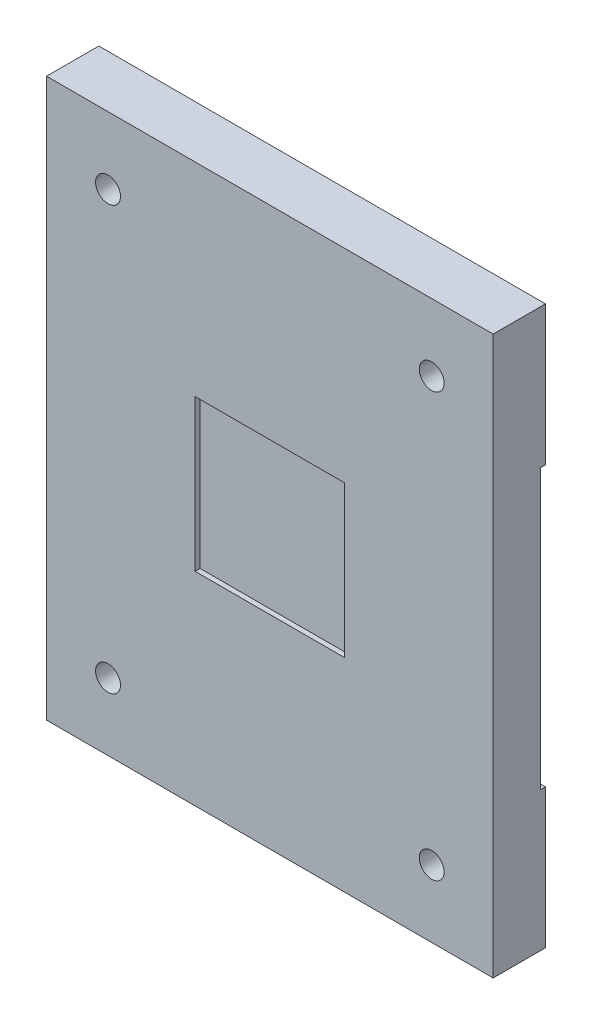
ISO-10303-21;
HEADER;
FILE_DESCRIPTION(('STEP AP214'),'2;1');
FILE_NAME('part.step','',(''),(''),'','','');
FILE_SCHEMA(('AUTOMOTIVE_DESIGN { 1 0 10303 214 1 1 1 1 }'));
ENDSEC;
DATA;
#1=APPLICATION_CONTEXT('core data for automotive mechanical design processes');
#2=APPLICATION_PROTOCOL_DEFINITION('international standard','automotive_design',2000,#1);
#3=PRODUCT_CONTEXT('',#1,'mechanical');
#4=PRODUCT('Part','Part','',(#3));
#5=PRODUCT_RELATED_PRODUCT_CATEGORY('part','',(#4));
#6=PRODUCT_DEFINITION_FORMATION('','',#4);
#7=PRODUCT_DEFINITION_CONTEXT('part definition',#1,'design');
#8=PRODUCT_DEFINITION('design','',#6,#7);
#9=PRODUCT_DEFINITION_SHAPE('','',#8);
#10=(LENGTH_UNIT() NAMED_UNIT(*) SI_UNIT(.MILLI.,.METRE.));
#11=(NAMED_UNIT(*) PLANE_ANGLE_UNIT() SI_UNIT($,.RADIAN.));
#12=(NAMED_UNIT(*) SI_UNIT($,.STERADIAN.) SOLID_ANGLE_UNIT());
#13=UNCERTAINTY_MEASURE_WITH_UNIT(LENGTH_MEASURE(1.E-05),#10,'distance_accuracy_value','');
#14=(GEOMETRIC_REPRESENTATION_CONTEXT(3) GLOBAL_UNCERTAINTY_ASSIGNED_CONTEXT((#13)) GLOBAL_UNIT_ASSIGNED_CONTEXT((#10,
#11,#12)) REPRESENTATION_CONTEXT('',''));
#15=CARTESIAN_POINT('',(0.,0.,0.));
#16=DIRECTION('',(0.,0.,1.));
#17=DIRECTION('',(1.,0.,0.));
#18=AXIS2_PLACEMENT_3D('',#15,#16,#17);
#19=CARTESIAN_POINT('',(0.,0.,0.));
#20=DIRECTION('',(0.,0.,-1.));
#21=DIRECTION('',(-1.,0.,0.));
#22=AXIS2_PLACEMENT_3D('',#19,#20,#21);
#23=PLANE('',#22);
#24=CARTESIAN_POINT('',(-15.15,25.7042452854726,0.));
#25=DIRECTION('',(0.,0.,-1.));
#26=DIRECTION('',(1.,0.,0.));
#27=AXIS2_PLACEMENT_3D('',#24,#25,#26);
#28=CIRCLE('',#27,5.);
#29=CARTESIAN_POINT('',(-10.15,25.7042452854726,0.));
#30=VERTEX_POINT('',#29);
#31=EDGE_CURVE('E252',#30,#30,#28,.T.);
#32=ORIENTED_EDGE('',*,*,#31,.F.);
#33=EDGE_LOOP('',(#32));
#34=FACE_BOUND('',#33,.T.);
#35=CARTESIAN_POINT('',(49.8500000000001,25.7042452854726,0.));
#36=DIRECTION('',(0.,0.,-1.));
#37=DIRECTION('',(-1.,0.,0.));
#38=AXIS2_PLACEMENT_3D('',#35,#36,#37);
#39=CIRCLE('',#38,5.);
#40=CARTESIAN_POINT('',(44.8500000000001,25.7042452854726,0.));
#41=VERTEX_POINT('',#40);
#42=EDGE_CURVE('E250',#41,#41,#39,.T.);
#43=ORIENTED_EDGE('',*,*,#42,.F.);
#44=EDGE_LOOP('',(#43));
#45=FACE_BOUND('',#44,.T.);
#46=DIRECTION('',(1.,0.,0.));
#47=VECTOR('',#46,1.);
#48=CARTESIAN_POINT('',(62.2,11.2042452854726,0.));
#49=LINE('',#48,#47);
#50=CARTESIAN_POINT('',(-27.5,11.2042452854726,0.));
#51=VERTEX_POINT('',#50);
#52=CARTESIAN_POINT('',(62.2,11.2042452854726,0.));
#53=VERTEX_POINT('',#52);
#54=EDGE_CURVE('E148',#51,#53,#49,.T.);
#55=ORIENTED_EDGE('',*,*,#54,.F.);
#56=DIRECTION('',(0.,-1.,0.));
#57=VECTOR('',#56,1.);
#58=CARTESIAN_POINT('',(-27.5,39.2042452854726,0.));
#59=LINE('',#58,#57);
#60=CARTESIAN_POINT('',(-27.5,39.2042452854726,0.));
#61=VERTEX_POINT('',#60);
#62=EDGE_CURVE('E208',#61,#51,#59,.T.);
#63=ORIENTED_EDGE('',*,*,#62,.F.);
#64=DIRECTION('',(-1.,0.,0.));
#65=VECTOR('',#64,1.);
#66=CARTESIAN_POINT('',(-27.5,39.2042452854726,0.));
#67=LINE('',#66,#65);
#68=CARTESIAN_POINT('',(62.2,39.2042452854726,0.));
#69=VERTEX_POINT('',#68);
#70=EDGE_CURVE('E201',#69,#61,#67,.T.);
#71=ORIENTED_EDGE('',*,*,#70,.F.);
#72=DIRECTION('',(0.,1.,0.));
#73=VECTOR('',#72,1.);
#74=CARTESIAN_POINT('',(62.2,39.2042452854726,0.));
#75=LINE('',#74,#73);
#76=EDGE_CURVE('E213',#53,#69,#75,.T.);
#77=ORIENTED_EDGE('',*,*,#76,.F.);
#78=EDGE_LOOP('',(#55,#63,#71,#77));
#79=FACE_BOUND('',#78,.T.);
#80=ADVANCED_FACE('F46',(#34,#45,#79),#23,.T.);
#81=CARTESIAN_POINT('',(-27.5,39.2042452854726,10.5));
#82=DIRECTION('',(1.,0.,0.));
#83=DIRECTION('',(0.,1.,0.));
#84=AXIS2_PLACEMENT_3D('',#81,#82,#83);
#85=PLANE('',#84);
#86=ORIENTED_EDGE('',*,*,#62,.T.);
#87=DIRECTION('',(0.,0.,-1.));
#88=VECTOR('',#87,1.);
#89=CARTESIAN_POINT('',(-27.5,11.2042452854726,1.));
#90=LINE('',#89,#88);
#91=CARTESIAN_POINT('',(-27.5,11.2042452854726,1.));
#92=VERTEX_POINT('',#91);
#93=EDGE_CURVE('E161',#92,#51,#90,.T.);
#94=ORIENTED_EDGE('',*,*,#93,.F.);
#95=DIRECTION('',(0.,1.,0.));
#96=VECTOR('',#95,1.);
#97=CARTESIAN_POINT('',(-27.5,11.2042452854726,1.));
#98=LINE('',#97,#96);
#99=CARTESIAN_POINT('',(-27.5,-44.7957547145274,1.));
#100=VERTEX_POINT('',#99);
#101=EDGE_CURVE('E153',#100,#92,#98,.T.);
#102=ORIENTED_EDGE('',*,*,#101,.F.);
#103=DIRECTION('',(0.,0.,-1.));
#104=VECTOR('',#103,1.);
#105=CARTESIAN_POINT('',(-27.5,-44.7957547145274,1.));
#106=LINE('',#105,#104);
#107=CARTESIAN_POINT('',(-27.5,-44.7957547145274,0.));
#108=VERTEX_POINT('',#107);
#109=EDGE_CURVE('E152',#100,#108,#106,.T.);
#110=ORIENTED_EDGE('',*,*,#109,.T.);
#111=CARTESIAN_POINT('',(-27.5,-72.7957547145274,0.));
#112=VERTEX_POINT('',#111);
#113=EDGE_CURVE('E191',#108,#112,#59,.T.);
#114=ORIENTED_EDGE('',*,*,#113,.T.);
#115=DIRECTION('',(0.,0.,-1.));
#116=VECTOR('',#115,1.);
#117=CARTESIAN_POINT('',(-27.5,-72.7957547145274,10.5));
#118=LINE('',#117,#116);
#119=CARTESIAN_POINT('',(-27.5,-72.7957547145274,10.5));
#120=VERTEX_POINT('',#119);
#121=EDGE_CURVE('E11',#120,#112,#118,.T.);
#122=ORIENTED_EDGE('',*,*,#121,.F.);
#123=DIRECTION('',(0.,-1.,0.));
#124=VECTOR('',#123,1.);
#125=CARTESIAN_POINT('',(-27.5,39.2042452854726,10.5));
#126=LINE('',#125,#124);
#127=CARTESIAN_POINT('',(-27.5,39.2042452854726,10.5));
#128=VERTEX_POINT('',#127);
#129=EDGE_CURVE('E197',#128,#120,#126,.T.);
#130=ORIENTED_EDGE('',*,*,#129,.F.);
#131=DIRECTION('',(0.,0.,-1.));
#132=VECTOR('',#131,1.);
#133=CARTESIAN_POINT('',(-27.5,39.2042452854726,10.5));
#134=LINE('',#133,#132);
#135=EDGE_CURVE('E207',#128,#61,#134,.T.);
#136=ORIENTED_EDGE('',*,*,#135,.T.);
#137=EDGE_LOOP('',(#86,#94,#102,#110,#114,#122,#130,#136));
#138=FACE_BOUND('',#137,.T.);
#139=ADVANCED_FACE('F48',(#138),#85,.F.);
#140=CARTESIAN_POINT('',(62.2,-72.7957547145274,10.5));
#141=DIRECTION('',(0.,1.,0.));
#142=DIRECTION('',(-1.,0.,0.));
#143=AXIS2_PLACEMENT_3D('',#140,#141,#142);
#144=PLANE('',#143);
#145=DIRECTION('',(1.,0.,0.));
#146=VECTOR('',#145,1.);
#147=CARTESIAN_POINT('',(62.2,-72.7957547145274,0.));
#148=LINE('',#147,#146);
#149=CARTESIAN_POINT('',(62.2,-72.7957547145274,0.));
#150=VERTEX_POINT('',#149);
#151=EDGE_CURVE('E211',#112,#150,#148,.T.);
#152=ORIENTED_EDGE('',*,*,#151,.T.);
#153=DIRECTION('',(0.,0.,-1.));
#154=VECTOR('',#153,1.);
#155=CARTESIAN_POINT('',(62.2,-72.7957547145274,10.5));
#156=LINE('',#155,#154);
#157=CARTESIAN_POINT('',(62.2,-72.7957547145274,10.5));
#158=VERTEX_POINT('',#157);
#159=EDGE_CURVE('E55',#158,#150,#156,.T.);
#160=ORIENTED_EDGE('',*,*,#159,.F.);
#161=DIRECTION('',(1.,0.,0.));
#162=VECTOR('',#161,1.);
#163=CARTESIAN_POINT('',(62.2,-72.7957547145274,10.5));
#164=LINE('',#163,#162);
#165=EDGE_CURVE('E200',#120,#158,#164,.T.);
#166=ORIENTED_EDGE('',*,*,#165,.F.);
#167=ORIENTED_EDGE('',*,*,#121,.T.);
#168=EDGE_LOOP('',(#152,#160,#166,#167));
#169=FACE_BOUND('',#168,.T.);
#170=ADVANCED_FACE('F278',(#169),#144,.F.);
#171=CARTESIAN_POINT('',(62.2,39.2042452854726,10.5));
#172=DIRECTION('',(-1.,0.,0.));
#173=DIRECTION('',(0.,0.,1.));
#174=AXIS2_PLACEMENT_3D('',#171,#172,#173);
#175=PLANE('',#174);
#176=DIRECTION('',(0.,-1.,0.));
#177=VECTOR('',#176,1.);
#178=CARTESIAN_POINT('',(62.2,-16.7957547145274,1.));
#179=LINE('',#178,#177);
#180=CARTESIAN_POINT('',(62.2,11.2042452854726,1.));
#181=VERTEX_POINT('',#180);
#182=CARTESIAN_POINT('',(62.2,-44.7957547145274,1.));
#183=VERTEX_POINT('',#182);
#184=EDGE_CURVE('E140',#181,#183,#179,.T.);
#185=ORIENTED_EDGE('',*,*,#184,.F.);
#186=DIRECTION('',(0.,0.,-1.));
#187=VECTOR('',#186,1.);
#188=CARTESIAN_POINT('',(62.2,11.2042452854726,1.));
#189=LINE('',#188,#187);
#190=EDGE_CURVE('E182',#181,#53,#189,.T.);
#191=ORIENTED_EDGE('',*,*,#190,.T.);
#192=ORIENTED_EDGE('',*,*,#76,.T.);
#193=DIRECTION('',(0.,0.,-1.));
#194=VECTOR('',#193,1.);
#195=CARTESIAN_POINT('',(62.2,39.2042452854726,10.5));
#196=LINE('',#195,#194);
#197=CARTESIAN_POINT('',(62.2,39.2042452854726,10.5));
#198=VERTEX_POINT('',#197);
#199=EDGE_CURVE('E218',#198,#69,#196,.T.);
#200=ORIENTED_EDGE('',*,*,#199,.F.);
#201=DIRECTION('',(0.,1.,0.));
#202=VECTOR('',#201,1.);
#203=CARTESIAN_POINT('',(62.2,39.2042452854726,10.5));
#204=LINE('',#203,#202);
#205=EDGE_CURVE('E203',#158,#198,#204,.T.);
#206=ORIENTED_EDGE('',*,*,#205,.F.);
#207=ORIENTED_EDGE('',*,*,#159,.T.);
#208=CARTESIAN_POINT('',(62.2,-44.7957547145274,0.));
#209=VERTEX_POINT('',#208);
#210=EDGE_CURVE('E159',#150,#209,#75,.T.);
#211=ORIENTED_EDGE('',*,*,#210,.T.);
#212=DIRECTION('',(0.,0.,-1.));
#213=VECTOR('',#212,1.);
#214=CARTESIAN_POINT('',(62.2,-44.7957547145274,1.));
#215=LINE('',#214,#213);
#216=EDGE_CURVE('E63',#183,#209,#215,.T.);
#217=ORIENTED_EDGE('',*,*,#216,.F.);
#218=EDGE_LOOP('',(#185,#191,#192,#200,#206,#207,#211,#217));
#219=FACE_BOUND('',#218,.T.);
#220=ADVANCED_FACE('F156',(#219),#175,.F.);
#221=CARTESIAN_POINT('',(-27.5,39.2042452854726,10.5));
#222=DIRECTION('',(0.,-1.,0.));
#223=DIRECTION('',(0.,0.,-1.));
#224=AXIS2_PLACEMENT_3D('',#221,#222,#223);
#225=PLANE('',#224);
#226=ORIENTED_EDGE('',*,*,#70,.T.);
#227=ORIENTED_EDGE('',*,*,#135,.F.);
#228=DIRECTION('',(-1.,0.,0.));
#229=VECTOR('',#228,1.);
#230=CARTESIAN_POINT('',(-27.5,39.2042452854726,10.5));
#231=LINE('',#230,#229);
#232=EDGE_CURVE('E205',#198,#128,#231,.T.);
#233=ORIENTED_EDGE('',*,*,#232,.F.);
#234=ORIENTED_EDGE('',*,*,#199,.T.);
#235=EDGE_LOOP('',(#226,#227,#233,#234));
#236=FACE_BOUND('',#235,.T.);
#237=ADVANCED_FACE('F271',(#236),#225,.F.);
#238=CARTESIAN_POINT('',(0.,0.,10.5));
#239=DIRECTION('',(0.,0.,-1.));
#240=DIRECTION('',(-1.,0.,0.));
#241=AXIS2_PLACEMENT_3D('',#238,#239,#240);
#242=PLANE('',#241);
#243=CARTESIAN_POINT('',(-15.15,25.7042452854726,10.5));
#244=DIRECTION('',(0.,0.,-1.));
#245=DIRECTION('',(-1.,0.,0.));
#246=AXIS2_PLACEMENT_3D('',#243,#244,#245);
#247=CIRCLE('',#246,2.5);
#248=CARTESIAN_POINT('',(-17.6499999999999,25.7042452854726,10.5));
#249=VERTEX_POINT('',#248);
#250=EDGE_CURVE('E50',#249,#249,#247,.T.);
#251=ORIENTED_EDGE('',*,*,#250,.T.);
#252=EDGE_LOOP('',(#251));
#253=FACE_BOUND('',#252,.T.);
#254=CARTESIAN_POINT('',(49.8500000000001,-59.2957547145274,10.5));
#255=DIRECTION('',(0.,0.,-1.));
#256=DIRECTION('',(-1.,0.,0.));
#257=AXIS2_PLACEMENT_3D('',#254,#255,#256);
#258=CIRCLE('',#257,2.5);
#259=CARTESIAN_POINT('',(47.3500000000001,-59.2957547145274,10.5));
#260=VERTEX_POINT('',#259);
#261=EDGE_CURVE('E228',#260,#260,#258,.T.);
#262=ORIENTED_EDGE('',*,*,#261,.T.);
#263=EDGE_LOOP('',(#262));
#264=FACE_BOUND('',#263,.T.);
#265=CARTESIAN_POINT('',(-15.15,-59.2957547145274,10.5));
#266=DIRECTION('',(0.,0.,-1.));
#267=DIRECTION('',(-1.,0.,0.));
#268=AXIS2_PLACEMENT_3D('',#265,#266,#267);
#269=CIRCLE('',#268,2.5);
#270=CARTESIAN_POINT('',(-17.6499999999999,-59.2957547145274,10.5));
#271=VERTEX_POINT('',#270);
#272=EDGE_CURVE('E225',#271,#271,#269,.T.);
#273=ORIENTED_EDGE('',*,*,#272,.T.);
#274=EDGE_LOOP('',(#273));
#275=FACE_BOUND('',#274,.T.);
#276=CARTESIAN_POINT('',(49.8500000000001,25.7042452854726,10.5));
#277=DIRECTION('',(0.,0.,-1.));
#278=DIRECTION('',(-1.,0.,0.));
#279=AXIS2_PLACEMENT_3D('',#276,#277,#278);
#280=CIRCLE('',#279,2.5);
#281=CARTESIAN_POINT('',(47.3500000000001,25.7042452854726,10.5));
#282=VERTEX_POINT('',#281);
#283=EDGE_CURVE('E222',#282,#282,#280,.T.);
#284=ORIENTED_EDGE('',*,*,#283,.T.);
#285=EDGE_LOOP('',(#284));
#286=FACE_BOUND('',#285,.T.);
#287=DIRECTION('',(0.,-1.,0.));
#288=VECTOR('',#287,1.);
#289=CARTESIAN_POINT('',(2.35000000000005,-31.9957547145274,10.5));
#290=LINE('',#289,#288);
#291=CARTESIAN_POINT('',(2.35000000000005,-1.59575471452741,10.5));
#292=VERTEX_POINT('',#291);
#293=CARTESIAN_POINT('',(2.35000000000005,-31.9957547145274,10.5));
#294=VERTEX_POINT('',#293);
#295=EDGE_CURVE('E179',#292,#294,#290,.T.);
#296=ORIENTED_EDGE('',*,*,#295,.F.);
#297=DIRECTION('',(-1.,0.,0.));
#298=VECTOR('',#297,1.);
#299=CARTESIAN_POINT('',(17.35,-1.59575471452741,10.5));
#300=LINE('',#299,#298);
#301=CARTESIAN_POINT('',(32.35,-1.59575471452741,10.5));
#302=VERTEX_POINT('',#301);
#303=EDGE_CURVE('E170',#302,#292,#300,.T.);
#304=ORIENTED_EDGE('',*,*,#303,.F.);
#305=DIRECTION('',(0.,1.,0.));
#306=VECTOR('',#305,1.);
#307=CARTESIAN_POINT('',(32.35,-1.59575471452741,10.5));
#308=LINE('',#307,#306);
#309=CARTESIAN_POINT('',(32.35,-31.9957547145274,10.5));
#310=VERTEX_POINT('',#309);
#311=EDGE_CURVE('E185',#310,#302,#308,.T.);
#312=ORIENTED_EDGE('',*,*,#311,.F.);
#313=DIRECTION('',(1.,0.,0.));
#314=VECTOR('',#313,1.);
#315=CARTESIAN_POINT('',(32.35,-31.9957547145274,10.5));
#316=LINE('',#315,#314);
#317=EDGE_CURVE('E181',#294,#310,#316,.T.);
#318=ORIENTED_EDGE('',*,*,#317,.F.);
#319=EDGE_LOOP('',(#296,#304,#312,#318));
#320=FACE_BOUND('',#319,.T.);
#321=ORIENTED_EDGE('',*,*,#129,.T.);
#322=ORIENTED_EDGE('',*,*,#165,.T.);
#323=ORIENTED_EDGE('',*,*,#205,.T.);
#324=ORIENTED_EDGE('',*,*,#232,.T.);
#325=EDGE_LOOP('',(#321,#322,#323,#324));
#326=FACE_BOUND('',#325,.T.);
#327=ADVANCED_FACE('F276',(#253,#264,#275,#286,#320,#326),#242,.F.);
#328=CARTESIAN_POINT('',(49.8500000000001,-59.2957547145274,0.));
#329=DIRECTION('',(0.,0.,-1.));
#330=DIRECTION('',(1.,0.,0.));
#331=AXIS2_PLACEMENT_3D('',#328,#329,#330);
#332=CIRCLE('',#331,5.);
#333=CARTESIAN_POINT('',(54.8500000000001,-59.2957547145274,0.));
#334=VERTEX_POINT('',#333);
#335=EDGE_CURVE('E237',#334,#334,#332,.T.);
#336=ORIENTED_EDGE('',*,*,#335,.F.);
#337=EDGE_LOOP('',(#336));
#338=FACE_BOUND('',#337,.T.);
#339=CARTESIAN_POINT('',(-15.15,-59.2957547145274,0.));
#340=DIRECTION('',(0.,0.,-1.));
#341=DIRECTION('',(-1.,0.,0.));
#342=AXIS2_PLACEMENT_3D('',#339,#340,#341);
#343=CIRCLE('',#342,5.);
#344=CARTESIAN_POINT('',(-20.15,-59.2957547145274,0.));
#345=VERTEX_POINT('',#344);
#346=EDGE_CURVE('E590',#345,#345,#343,.T.);
#347=ORIENTED_EDGE('',*,*,#346,.F.);
#348=EDGE_LOOP('',(#347));
#349=FACE_BOUND('',#348,.T.);
#350=DIRECTION('',(-1.,0.,0.));
#351=VECTOR('',#350,1.);
#352=CARTESIAN_POINT('',(-27.5,-44.7957547145274,0.));
#353=LINE('',#352,#351);
#354=EDGE_CURVE('E249',#209,#108,#353,.T.);
#355=ORIENTED_EDGE('',*,*,#354,.F.);
#356=ORIENTED_EDGE('',*,*,#210,.F.);
#357=ORIENTED_EDGE('',*,*,#151,.F.);
#358=ORIENTED_EDGE('',*,*,#113,.F.);
#359=EDGE_LOOP('',(#355,#356,#357,#358));
#360=FACE_BOUND('',#359,.T.);
#361=ADVANCED_FACE('F282',(#338,#349,#360),#23,.T.);
#362=CARTESIAN_POINT('',(17.35,-1.59575471452741,9.50000000000001));
#363=DIRECTION('',(0.,1.,0.));
#364=DIRECTION('',(-1.,0.,0.));
#365=AXIS2_PLACEMENT_3D('',#362,#363,#364);
#366=PLANE('',#365);
#367=ORIENTED_EDGE('',*,*,#303,.T.);
#368=DIRECTION('',(0.,0.,1.));
#369=VECTOR('',#368,1.);
#370=CARTESIAN_POINT('',(2.35000000000005,-1.59575471452741,9.50000000000001));
#371=LINE('',#370,#369);
#372=CARTESIAN_POINT('',(2.35000000000005,-1.59575471452741,9.50000000000001));
#373=VERTEX_POINT('',#372);
#374=EDGE_CURVE('E71',#373,#292,#371,.T.);
#375=ORIENTED_EDGE('',*,*,#374,.F.);
#376=DIRECTION('',(-1.,0.,0.));
#377=VECTOR('',#376,1.);
#378=CARTESIAN_POINT('',(17.35,-1.59575471452741,9.50000000000001));
#379=LINE('',#378,#377);
#380=CARTESIAN_POINT('',(32.35,-1.59575471452741,9.50000000000001));
#381=VERTEX_POINT('',#380);
#382=EDGE_CURVE('E166',#381,#373,#379,.T.);
#383=ORIENTED_EDGE('',*,*,#382,.F.);
#384=DIRECTION('',(0.,0.,1.));
#385=VECTOR('',#384,1.);
#386=CARTESIAN_POINT('',(32.35,-1.59575471452741,9.50000000000001));
#387=LINE('',#386,#385);
#388=EDGE_CURVE('E189',#381,#302,#387,.T.);
#389=ORIENTED_EDGE('',*,*,#388,.T.);
#390=EDGE_LOOP('',(#367,#375,#383,#389));
#391=FACE_BOUND('',#390,.T.);
#392=ADVANCED_FACE('F284',(#391),#366,.F.);
#393=CARTESIAN_POINT('',(32.35,-1.59575471452741,9.50000000000001));
#394=DIRECTION('',(1.,0.,0.));
#395=DIRECTION('',(0.,0.,-1.));
#396=AXIS2_PLACEMENT_3D('',#393,#394,#395);
#397=PLANE('',#396);
#398=ORIENTED_EDGE('',*,*,#311,.T.);
#399=ORIENTED_EDGE('',*,*,#388,.F.);
#400=DIRECTION('',(0.,1.,0.));
#401=VECTOR('',#400,1.);
#402=CARTESIAN_POINT('',(32.35,-1.59575471452741,9.50000000000001));
#403=LINE('',#402,#401);
#404=CARTESIAN_POINT('',(32.35,-31.9957547145274,9.50000000000001));
#405=VERTEX_POINT('',#404);
#406=EDGE_CURVE('E176',#405,#381,#403,.T.);
#407=ORIENTED_EDGE('',*,*,#406,.F.);
#408=DIRECTION('',(0.,0.,1.));
#409=VECTOR('',#408,1.);
#410=CARTESIAN_POINT('',(32.35,-31.9957547145274,9.50000000000001));
#411=LINE('',#410,#409);
#412=EDGE_CURVE('E192',#405,#310,#411,.T.);
#413=ORIENTED_EDGE('',*,*,#412,.T.);
#414=EDGE_LOOP('',(#398,#399,#407,#413));
#415=FACE_BOUND('',#414,.T.);
#416=ADVANCED_FACE('F292',(#415),#397,.F.);
#417=CARTESIAN_POINT('',(32.35,-31.9957547145274,9.50000000000001));
#418=DIRECTION('',(0.,-1.,0.));
#419=DIRECTION('',(0.,0.,-1.));
#420=AXIS2_PLACEMENT_3D('',#417,#418,#419);
#421=PLANE('',#420);
#422=ORIENTED_EDGE('',*,*,#317,.T.);
#423=ORIENTED_EDGE('',*,*,#412,.F.);
#424=DIRECTION('',(1.,0.,0.));
#425=VECTOR('',#424,1.);
#426=CARTESIAN_POINT('',(32.35,-31.9957547145274,9.50000000000001));
#427=LINE('',#426,#425);
#428=CARTESIAN_POINT('',(2.35000000000005,-31.9957547145274,9.50000000000001));
#429=VERTEX_POINT('',#428);
#430=EDGE_CURVE('E173',#429,#405,#427,.T.);
#431=ORIENTED_EDGE('',*,*,#430,.F.);
#432=DIRECTION('',(0.,0.,1.));
#433=VECTOR('',#432,1.);
#434=CARTESIAN_POINT('',(2.35000000000005,-31.9957547145274,9.50000000000001));
#435=LINE('',#434,#433);
#436=EDGE_CURVE('E194',#429,#294,#435,.T.);
#437=ORIENTED_EDGE('',*,*,#436,.T.);
#438=EDGE_LOOP('',(#422,#423,#431,#437));
#439=FACE_BOUND('',#438,.T.);
#440=ADVANCED_FACE('F344',(#439),#421,.F.);
#441=CARTESIAN_POINT('',(2.35000000000005,-31.9957547145274,9.50000000000001));
#442=DIRECTION('',(-1.,0.,0.));
#443=DIRECTION('',(0.,0.,1.));
#444=AXIS2_PLACEMENT_3D('',#441,#442,#443);
#445=PLANE('',#444);
#446=ORIENTED_EDGE('',*,*,#295,.T.);
#447=ORIENTED_EDGE('',*,*,#436,.F.);
#448=DIRECTION('',(0.,-1.,0.));
#449=VECTOR('',#448,1.);
#450=CARTESIAN_POINT('',(2.35000000000005,-31.9957547145274,9.50000000000001));
#451=LINE('',#450,#449);
#452=EDGE_CURVE('E169',#373,#429,#451,.T.);
#453=ORIENTED_EDGE('',*,*,#452,.F.);
#454=ORIENTED_EDGE('',*,*,#374,.T.);
#455=EDGE_LOOP('',(#446,#447,#453,#454));
#456=FACE_BOUND('',#455,.T.);
#457=ADVANCED_FACE('F339',(#456),#445,.F.);
#458=CARTESIAN_POINT('',(0.,0.,9.50000000000001));
#459=DIRECTION('',(0.,0.,-1.));
#460=DIRECTION('',(-1.,0.,0.));
#461=AXIS2_PLACEMENT_3D('',#458,#459,#460);
#462=PLANE('',#461);
#463=ORIENTED_EDGE('',*,*,#382,.T.);
#464=ORIENTED_EDGE('',*,*,#452,.T.);
#465=ORIENTED_EDGE('',*,*,#430,.T.);
#466=ORIENTED_EDGE('',*,*,#406,.T.);
#467=EDGE_LOOP('',(#463,#464,#465,#466));
#468=FACE_BOUND('',#467,.T.);
#469=ADVANCED_FACE('F335',(#468),#462,.F.);
#470=CARTESIAN_POINT('',(62.2,11.2042452854726,1.));
#471=DIRECTION('',(0.,1.,0.));
#472=DIRECTION('',(0.,0.,1.));
#473=AXIS2_PLACEMENT_3D('',#470,#471,#472);
#474=PLANE('',#473);
#475=ORIENTED_EDGE('',*,*,#54,.T.);
#476=ORIENTED_EDGE('',*,*,#190,.F.);
#477=DIRECTION('',(1.,0.,0.));
#478=VECTOR('',#477,1.);
#479=CARTESIAN_POINT('',(62.2,11.2042452854726,1.));
#480=LINE('',#479,#478);
#481=EDGE_CURVE('E145',#92,#181,#480,.T.);
#482=ORIENTED_EDGE('',*,*,#481,.F.);
#483=ORIENTED_EDGE('',*,*,#93,.T.);
#484=EDGE_LOOP('',(#475,#476,#482,#483));
#485=FACE_BOUND('',#484,.T.);
#486=ADVANCED_FACE('F260',(#485),#474,.F.);
#487=CARTESIAN_POINT('',(-27.5,-44.7957547145274,1.));
#488=DIRECTION('',(0.,-1.,0.));
#489=DIRECTION('',(0.,0.,-1.));
#490=AXIS2_PLACEMENT_3D('',#487,#488,#489);
#491=PLANE('',#490);
#492=ORIENTED_EDGE('',*,*,#354,.T.);
#493=ORIENTED_EDGE('',*,*,#109,.F.);
#494=DIRECTION('',(-1.,0.,0.));
#495=VECTOR('',#494,1.);
#496=CARTESIAN_POINT('',(-27.5,-44.7957547145274,1.));
#497=LINE('',#496,#495);
#498=EDGE_CURVE('E142',#183,#100,#497,.T.);
#499=ORIENTED_EDGE('',*,*,#498,.F.);
#500=ORIENTED_EDGE('',*,*,#216,.T.);
#501=EDGE_LOOP('',(#492,#493,#499,#500));
#502=FACE_BOUND('',#501,.T.);
#503=ADVANCED_FACE('F150',(#502),#491,.F.);
#504=CARTESIAN_POINT('',(0.,0.,1.));
#505=DIRECTION('',(0.,0.,1.));
#506=DIRECTION('',(1.,0.,0.));
#507=AXIS2_PLACEMENT_3D('',#504,#505,#506);
#508=PLANE('',#507);
#509=ORIENTED_EDGE('',*,*,#184,.T.);
#510=ORIENTED_EDGE('',*,*,#498,.T.);
#511=ORIENTED_EDGE('',*,*,#101,.T.);
#512=ORIENTED_EDGE('',*,*,#481,.T.);
#513=EDGE_LOOP('',(#509,#510,#511,#512));
#514=FACE_BOUND('',#513,.T.);
#515=ADVANCED_FACE('F141',(#514),#508,.F.);
#516=CARTESIAN_POINT('',(-15.15,-59.2957547145274,4.));
#517=DIRECTION('',(0.,0.,-1.));
#518=DIRECTION('',(-1.,0.,0.));
#519=AXIS2_PLACEMENT_3D('',#516,#517,#518);
#520=CYLINDRICAL_SURFACE('',#519,5.);
#521=CARTESIAN_POINT('',(-15.15,-59.2957547145274,4.));
#522=DIRECTION('',(0.,0.,-1.));
#523=DIRECTION('',(-1.,0.,0.));
#524=AXIS2_PLACEMENT_3D('',#521,#522,#523);
#525=CIRCLE('',#524,5.);
#526=CARTESIAN_POINT('',(-20.15,-59.2957547145274,4.));
#527=VERTEX_POINT('',#526);
#528=EDGE_CURVE('E242',#527,#527,#525,.T.);
#529=ORIENTED_EDGE('',*,*,#528,.F.);
#530=EDGE_LOOP('',(#529));
#531=FACE_BOUND('',#530,.T.);
#532=ORIENTED_EDGE('',*,*,#346,.T.);
#533=EDGE_LOOP('',(#532));
#534=FACE_BOUND('',#533,.T.);
#535=ADVANCED_FACE('F332',(#531,#534),#520,.F.);
#536=CARTESIAN_POINT('',(-15.15,-59.2957547145274,4.));
#537=DIRECTION('',(0.,0.,-1.));
#538=DIRECTION('',(-1.,0.,0.));
#539=AXIS2_PLACEMENT_3D('',#536,#537,#538);
#540=PLANE('',#539);
#541=CARTESIAN_POINT('',(-15.15,-59.2957547145274,4.));
#542=DIRECTION('',(0.,0.,-1.));
#543=DIRECTION('',(-1.,0.,0.));
#544=AXIS2_PLACEMENT_3D('',#541,#542,#543);
#545=CIRCLE('',#544,2.5);
#546=CARTESIAN_POINT('',(-17.6499999999999,-59.2957547145274,4.));
#547=VERTEX_POINT('',#546);
#548=EDGE_CURVE('E582',#547,#547,#545,.T.);
#549=ORIENTED_EDGE('',*,*,#548,.F.);
#550=EDGE_LOOP('',(#549));
#551=FACE_BOUND('',#550,.T.);
#552=ORIENTED_EDGE('',*,*,#528,.T.);
#553=EDGE_LOOP('',(#552));
#554=FACE_BOUND('',#553,.T.);
#555=ADVANCED_FACE('F435',(#551,#554),#540,.T.);
#556=CARTESIAN_POINT('',(49.8500000000001,-59.2957547145274,4.));
#557=DIRECTION('',(0.,0.,-1.));
#558=DIRECTION('',(-1.,0.,0.));
#559=AXIS2_PLACEMENT_3D('',#556,#557,#558);
#560=CYLINDRICAL_SURFACE('',#559,5.);
#561=CARTESIAN_POINT('',(49.8500000000001,-59.2957547145274,4.));
#562=DIRECTION('',(0.,0.,-1.));
#563=DIRECTION('',(1.,0.,0.));
#564=AXIS2_PLACEMENT_3D('',#561,#562,#563);
#565=CIRCLE('',#564,5.);
#566=CARTESIAN_POINT('',(54.8500000000001,-59.2957547145274,4.));
#567=VERTEX_POINT('',#566);
#568=EDGE_CURVE('E233',#567,#567,#565,.T.);
#569=ORIENTED_EDGE('',*,*,#568,.F.);
#570=EDGE_LOOP('',(#569));
#571=FACE_BOUND('',#570,.T.);
#572=ORIENTED_EDGE('',*,*,#335,.T.);
#573=EDGE_LOOP('',(#572));
#574=FACE_BOUND('',#573,.T.);
#575=ADVANCED_FACE('F325',(#571,#574),#560,.F.);
#576=CARTESIAN_POINT('',(49.8500000000001,-59.2957547145274,4.));
#577=DIRECTION('',(0.,0.,1.));
#578=DIRECTION('',(1.,0.,0.));
#579=AXIS2_PLACEMENT_3D('',#576,#577,#578);
#580=PLANE('',#579);
#581=CARTESIAN_POINT('',(49.8500000000001,-59.2957547145274,4.));
#582=DIRECTION('',(0.,0.,-1.));
#583=DIRECTION('',(-1.,0.,0.));
#584=AXIS2_PLACEMENT_3D('',#581,#582,#583);
#585=CIRCLE('',#584,2.5);
#586=CARTESIAN_POINT('',(47.3500000000001,-59.2957547145274,4.));
#587=VERTEX_POINT('',#586);
#588=EDGE_CURVE('E577',#587,#587,#585,.T.);
#589=ORIENTED_EDGE('',*,*,#588,.F.);
#590=EDGE_LOOP('',(#589));
#591=FACE_BOUND('',#590,.T.);
#592=ORIENTED_EDGE('',*,*,#568,.T.);
#593=EDGE_LOOP('',(#592));
#594=FACE_BOUND('',#593,.T.);
#595=ADVANCED_FACE('F313',(#591,#594),#580,.F.);
#596=CARTESIAN_POINT('',(49.8500000000001,25.7042452854726,4.));
#597=DIRECTION('',(0.,0.,-1.));
#598=DIRECTION('',(-1.,0.,0.));
#599=AXIS2_PLACEMENT_3D('',#596,#597,#598);
#600=CYLINDRICAL_SURFACE('',#599,5.);
#601=CARTESIAN_POINT('',(49.8500000000001,25.7042452854726,4.));
#602=DIRECTION('',(0.,0.,-1.));
#603=DIRECTION('',(-1.,0.,0.));
#604=AXIS2_PLACEMENT_3D('',#601,#602,#603);
#605=CIRCLE('',#604,5.);
#606=CARTESIAN_POINT('',(44.8500000000001,25.7042452854726,4.));
#607=VERTEX_POINT('',#606);
#608=EDGE_CURVE('E246',#607,#607,#605,.T.);
#609=ORIENTED_EDGE('',*,*,#608,.F.);
#610=EDGE_LOOP('',(#609));
#611=FACE_BOUND('',#610,.T.);
#612=ORIENTED_EDGE('',*,*,#42,.T.);
#613=EDGE_LOOP('',(#612));
#614=FACE_BOUND('',#613,.T.);
#615=ADVANCED_FACE('F310',(#611,#614),#600,.F.);
#616=CARTESIAN_POINT('',(49.8500000000001,25.7042452854726,4.));
#617=DIRECTION('',(0.,0.,-1.));
#618=DIRECTION('',(-1.,0.,0.));
#619=AXIS2_PLACEMENT_3D('',#616,#617,#618);
#620=PLANE('',#619);
#621=CARTESIAN_POINT('',(49.8500000000001,25.7042452854726,4.));
#622=DIRECTION('',(0.,0.,-1.));
#623=DIRECTION('',(-1.,0.,0.));
#624=AXIS2_PLACEMENT_3D('',#621,#622,#623);
#625=CIRCLE('',#624,2.5);
#626=CARTESIAN_POINT('',(47.3500000000001,25.7042452854726,4.));
#627=VERTEX_POINT('',#626);
#628=EDGE_CURVE('E226',#627,#627,#625,.T.);
#629=ORIENTED_EDGE('',*,*,#628,.F.);
#630=EDGE_LOOP('',(#629));
#631=FACE_BOUND('',#630,.T.);
#632=ORIENTED_EDGE('',*,*,#608,.T.);
#633=EDGE_LOOP('',(#632));
#634=FACE_BOUND('',#633,.T.);
#635=ADVANCED_FACE('F312',(#631,#634),#620,.T.);
#636=CARTESIAN_POINT('',(-15.15,25.7042452854726,4.));
#637=DIRECTION('',(0.,0.,-1.));
#638=DIRECTION('',(-1.,0.,0.));
#639=AXIS2_PLACEMENT_3D('',#636,#637,#638);
#640=CYLINDRICAL_SURFACE('',#639,5.);
#641=CARTESIAN_POINT('',(-15.15,25.7042452854726,4.));
#642=DIRECTION('',(0.,0.,-1.));
#643=DIRECTION('',(1.,0.,0.));
#644=AXIS2_PLACEMENT_3D('',#641,#642,#643);
#645=CIRCLE('',#644,5.);
#646=CARTESIAN_POINT('',(-10.15,25.7042452854726,4.));
#647=VERTEX_POINT('',#646);
#648=EDGE_CURVE('E587',#647,#647,#645,.T.);
#649=ORIENTED_EDGE('',*,*,#648,.F.);
#650=EDGE_LOOP('',(#649));
#651=FACE_BOUND('',#650,.T.);
#652=ORIENTED_EDGE('',*,*,#31,.T.);
#653=EDGE_LOOP('',(#652));
#654=FACE_BOUND('',#653,.T.);
#655=ADVANCED_FACE('F321',(#651,#654),#640,.F.);
#656=CARTESIAN_POINT('',(-15.15,25.7042452854726,4.));
#657=DIRECTION('',(0.,0.,1.));
#658=DIRECTION('',(1.,0.,0.));
#659=AXIS2_PLACEMENT_3D('',#656,#657,#658);
#660=PLANE('',#659);
#661=CARTESIAN_POINT('',(-15.15,25.7042452854726,4.));
#662=DIRECTION('',(0.,0.,-1.));
#663=DIRECTION('',(-1.,0.,0.));
#664=AXIS2_PLACEMENT_3D('',#661,#662,#663);
#665=CIRCLE('',#664,2.5);
#666=CARTESIAN_POINT('',(-17.6499999999999,25.7042452854726,4.));
#667=VERTEX_POINT('',#666);
#668=EDGE_CURVE('E576',#667,#667,#665,.T.);
#669=ORIENTED_EDGE('',*,*,#668,.F.);
#670=EDGE_LOOP('',(#669));
#671=FACE_BOUND('',#670,.T.);
#672=ORIENTED_EDGE('',*,*,#648,.T.);
#673=EDGE_LOOP('',(#672));
#674=FACE_BOUND('',#673,.T.);
#675=ADVANCED_FACE('F472',(#671,#674),#660,.F.);
#676=CARTESIAN_POINT('',(49.8500000000001,25.7042452854726,14.));
#677=DIRECTION('',(0.,0.,-1.));
#678=DIRECTION('',(-1.,0.,0.));
#679=AXIS2_PLACEMENT_3D('',#676,#677,#678);
#680=CYLINDRICAL_SURFACE('',#679,2.5);
#681=ORIENTED_EDGE('',*,*,#628,.T.);
#682=EDGE_LOOP('',(#681));
#683=FACE_BOUND('',#682,.T.);
#684=ORIENTED_EDGE('',*,*,#283,.F.);
#685=EDGE_LOOP('',(#684));
#686=FACE_BOUND('',#685,.T.);
#687=ADVANCED_FACE('F481',(#683,#686),#680,.F.);
#688=CARTESIAN_POINT('',(-15.15,-59.2957547145274,14.));
#689=DIRECTION('',(0.,0.,-1.));
#690=DIRECTION('',(-1.,0.,0.));
#691=AXIS2_PLACEMENT_3D('',#688,#689,#690);
#692=CYLINDRICAL_SURFACE('',#691,2.5);
#693=ORIENTED_EDGE('',*,*,#548,.T.);
#694=EDGE_LOOP('',(#693));
#695=FACE_BOUND('',#694,.T.);
#696=ORIENTED_EDGE('',*,*,#272,.F.);
#697=EDGE_LOOP('',(#696));
#698=FACE_BOUND('',#697,.T.);
#699=ADVANCED_FACE('F490',(#695,#698),#692,.F.);
#700=CARTESIAN_POINT('',(49.8500000000001,-59.2957547145274,14.));
#701=DIRECTION('',(0.,0.,-1.));
#702=DIRECTION('',(-1.,0.,0.));
#703=AXIS2_PLACEMENT_3D('',#700,#701,#702);
#704=CYLINDRICAL_SURFACE('',#703,2.5);
#705=ORIENTED_EDGE('',*,*,#588,.T.);
#706=EDGE_LOOP('',(#705));
#707=FACE_BOUND('',#706,.T.);
#708=ORIENTED_EDGE('',*,*,#261,.F.);
#709=EDGE_LOOP('',(#708));
#710=FACE_BOUND('',#709,.T.);
#711=ADVANCED_FACE('F499',(#707,#710),#704,.F.);
#712=CARTESIAN_POINT('',(-15.15,25.7042452854726,14.));
#713=DIRECTION('',(0.,0.,-1.));
#714=DIRECTION('',(-1.,0.,0.));
#715=AXIS2_PLACEMENT_3D('',#712,#713,#714);
#716=CYLINDRICAL_SURFACE('',#715,2.5);
#717=ORIENTED_EDGE('',*,*,#668,.T.);
#718=EDGE_LOOP('',(#717));
#719=FACE_BOUND('',#718,.T.);
#720=ORIENTED_EDGE('',*,*,#250,.F.);
#721=EDGE_LOOP('',(#720));
#722=FACE_BOUND('',#721,.T.);
#723=ADVANCED_FACE('F508',(#719,#722),#716,.F.);
#724=CLOSED_SHELL('',(#80,#139,#170,#220,#237,#327,#361,#392,#416,#440,#457,#469,#486,#503,#515,
#535,#555,#575,#595,#615,#635,#655,#675,#687,#699,#711,#723));
#725=MANIFOLD_SOLID_BREP('B2',#724);
#726=ADVANCED_BREP_SHAPE_REPRESENTATION('',(#18,#725),#14);
#727=SHAPE_DEFINITION_REPRESENTATION(#9,#726);
ENDSEC;
END-ISO-10303-21;
